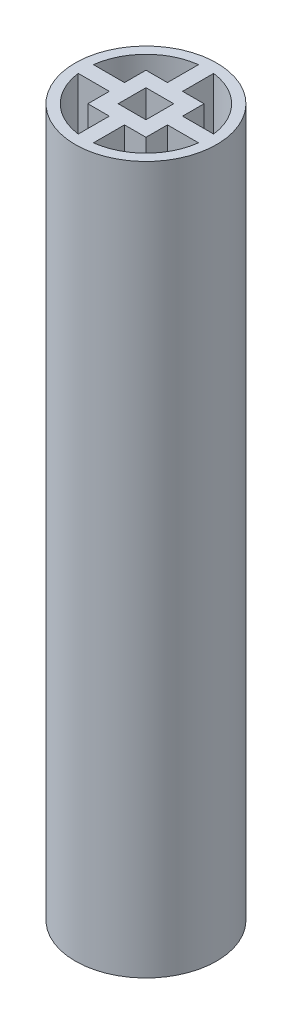
ISO-10303-21;
HEADER;
FILE_DESCRIPTION(('STEP AP214'),'2;1');
FILE_NAME('part.step','',(''),(''),'','','');
FILE_SCHEMA(('AUTOMOTIVE_DESIGN { 1 0 10303 214 1 1 1 1 }'));
ENDSEC;
DATA;
#1=APPLICATION_CONTEXT('core data for automotive mechanical design processes');
#2=APPLICATION_PROTOCOL_DEFINITION('international standard','automotive_design',2000,#1);
#3=PRODUCT_CONTEXT('',#1,'mechanical');
#4=PRODUCT('Part','Part','',(#3));
#5=PRODUCT_RELATED_PRODUCT_CATEGORY('part','',(#4));
#6=PRODUCT_DEFINITION_FORMATION('','',#4);
#7=PRODUCT_DEFINITION_CONTEXT('part definition',#1,'design');
#8=PRODUCT_DEFINITION('design','',#6,#7);
#9=PRODUCT_DEFINITION_SHAPE('','',#8);
#10=(LENGTH_UNIT() NAMED_UNIT(*) SI_UNIT(.MILLI.,.METRE.));
#11=(NAMED_UNIT(*) PLANE_ANGLE_UNIT() SI_UNIT($,.RADIAN.));
#12=(NAMED_UNIT(*) SI_UNIT($,.STERADIAN.) SOLID_ANGLE_UNIT());
#13=UNCERTAINTY_MEASURE_WITH_UNIT(LENGTH_MEASURE(1.E-05),#10,'distance_accuracy_value','');
#14=(GEOMETRIC_REPRESENTATION_CONTEXT(3) GLOBAL_UNCERTAINTY_ASSIGNED_CONTEXT((#13)) GLOBAL_UNIT_ASSIGNED_CONTEXT((#10,
#11,#12)) REPRESENTATION_CONTEXT('',''));
#15=CARTESIAN_POINT('',(0.,0.,0.));
#16=DIRECTION('',(0.,0.,1.));
#17=DIRECTION('',(1.,0.,0.));
#18=AXIS2_PLACEMENT_3D('',#15,#16,#17);
#19=CARTESIAN_POINT('',(0.,70.,0.));
#20=DIRECTION('',(0.,1.,0.));
#21=DIRECTION('',(0.,0.,1.));
#22=AXIS2_PLACEMENT_3D('',#19,#20,#21);
#23=PLANE('',#22);
#24=CARTESIAN_POINT('',(0.,70.,0.));
#25=DIRECTION('',(0.,1.,0.));
#26=DIRECTION('',(0.,0.,1.));
#27=AXIS2_PLACEMENT_3D('',#24,#25,#26);
#28=CIRCLE('',#27,14.);
#29=CARTESIAN_POINT('',(0.,70.,14.));
#30=VERTEX_POINT('',#29);
#31=EDGE_CURVE('E11',#30,#30,#28,.T.);
#32=ORIENTED_EDGE('',*,*,#31,.T.);
#33=EDGE_LOOP('',(#32));
#34=FACE_BOUND('',#33,.T.);
#35=DIRECTION('',(1.,0.,0.));
#36=VECTOR('',#35,1.);
#37=CARTESIAN_POINT('',(2.75,70.,2.75));
#38=LINE('',#37,#36);
#39=CARTESIAN_POINT('',(-2.75,70.,2.75));
#40=VERTEX_POINT('',#39);
#41=CARTESIAN_POINT('',(2.75,70.,2.75));
#42=VERTEX_POINT('',#41);
#43=EDGE_CURVE('E356',#40,#42,#38,.T.);
#44=ORIENTED_EDGE('',*,*,#43,.F.);
#45=DIRECTION('',(0.,0.,1.));
#46=VECTOR('',#45,1.);
#47=CARTESIAN_POINT('',(-2.75,70.,2.75));
#48=LINE('',#47,#46);
#49=CARTESIAN_POINT('',(-2.75,70.,-2.74999999999999));
#50=VERTEX_POINT('',#49);
#51=EDGE_CURVE('E354',#50,#40,#48,.T.);
#52=ORIENTED_EDGE('',*,*,#51,.F.);
#53=DIRECTION('',(-1.,0.,0.));
#54=VECTOR('',#53,1.);
#55=CARTESIAN_POINT('',(2.75,70.,-2.75));
#56=LINE('',#55,#54);
#57=CARTESIAN_POINT('',(2.75,70.,-2.75));
#58=VERTEX_POINT('',#57);
#59=EDGE_CURVE('E362',#58,#50,#56,.T.);
#60=ORIENTED_EDGE('',*,*,#59,.F.);
#61=DIRECTION('',(0.,0.,-1.));
#62=VECTOR('',#61,1.);
#63=CARTESIAN_POINT('',(2.75,70.,2.75));
#64=LINE('',#63,#62);
#65=EDGE_CURVE('E359',#42,#58,#64,.T.);
#66=ORIENTED_EDGE('',*,*,#65,.F.);
#67=EDGE_LOOP('',(#44,#52,#60,#66));
#68=FACE_BOUND('',#67,.T.);
#69=DIRECTION('',(0.,0.,-1.));
#70=VECTOR('',#69,1.);
#71=CARTESIAN_POINT('',(-1.5,70.,-11.9058808997907));
#72=LINE('',#71,#70);
#73=CARTESIAN_POINT('',(-1.5,70.,-5.75));
#74=VERTEX_POINT('',#73);
#75=CARTESIAN_POINT('',(-1.5,70.,-11.9058808997907));
#76=VERTEX_POINT('',#75);
#77=EDGE_CURVE('E318',#74,#76,#72,.T.);
#78=ORIENTED_EDGE('',*,*,#77,.F.);
#79=DIRECTION('',(1.,0.,0.));
#80=VECTOR('',#79,1.);
#81=CARTESIAN_POINT('',(-1.5,70.,-5.75));
#82=LINE('',#81,#80);
#83=CARTESIAN_POINT('',(-5.75,70.,-5.75));
#84=VERTEX_POINT('',#83);
#85=EDGE_CURVE('E316',#84,#74,#82,.T.);
#86=ORIENTED_EDGE('',*,*,#85,.F.);
#87=DIRECTION('',(0.,0.,-1.));
#88=VECTOR('',#87,1.);
#89=CARTESIAN_POINT('',(-5.75,70.,-1.5));
#90=LINE('',#89,#88);
#91=CARTESIAN_POINT('',(-5.75,70.,-1.5));
#92=VERTEX_POINT('',#91);
#93=EDGE_CURVE('E326',#92,#84,#90,.T.);
#94=ORIENTED_EDGE('',*,*,#93,.F.);
#95=DIRECTION('',(1.,0.,0.));
#96=VECTOR('',#95,1.);
#97=CARTESIAN_POINT('',(-5.75,70.,-1.5));
#98=LINE('',#97,#96);
#99=CARTESIAN_POINT('',(-11.9058808997907,70.,-1.5));
#100=VERTEX_POINT('',#99);
#101=EDGE_CURVE('E323',#100,#92,#98,.T.);
#102=ORIENTED_EDGE('',*,*,#101,.F.);
#103=CARTESIAN_POINT('',(0.,70.,0.));
#104=DIRECTION('',(0.,1.,0.));
#105=DIRECTION('',(0.,0.,1.));
#106=AXIS2_PLACEMENT_3D('',#103,#104,#105);
#107=CIRCLE('',#106,12.);
#108=EDGE_CURVE('E321',#76,#100,#107,.T.);
#109=ORIENTED_EDGE('',*,*,#108,.F.);
#110=EDGE_LOOP('',(#78,#86,#94,#102,#109));
#111=FACE_BOUND('',#110,.T.);
#112=DIRECTION('',(-1.,0.,0.));
#113=VECTOR('',#112,1.);
#114=CARTESIAN_POINT('',(5.75,70.,5.75));
#115=LINE('',#114,#113);
#116=CARTESIAN_POINT('',(5.75,70.,5.75));
#117=VERTEX_POINT('',#116);
#118=CARTESIAN_POINT('',(1.5,70.,5.75));
#119=VERTEX_POINT('',#118);
#120=EDGE_CURVE('E280',#117,#119,#115,.T.);
#121=ORIENTED_EDGE('',*,*,#120,.F.);
#122=DIRECTION('',(0.,0.,1.));
#123=VECTOR('',#122,1.);
#124=CARTESIAN_POINT('',(5.75,70.,5.75));
#125=LINE('',#124,#123);
#126=CARTESIAN_POINT('',(5.75,70.,1.5));
#127=VERTEX_POINT('',#126);
#128=EDGE_CURVE('E278',#127,#117,#125,.T.);
#129=ORIENTED_EDGE('',*,*,#128,.F.);
#130=DIRECTION('',(-1.,0.,0.));
#131=VECTOR('',#130,1.);
#132=CARTESIAN_POINT('',(5.75,70.,1.5));
#133=LINE('',#132,#131);
#134=CARTESIAN_POINT('',(11.9058808997907,70.,1.5));
#135=VERTEX_POINT('',#134);
#136=EDGE_CURVE('E288',#135,#127,#133,.T.);
#137=ORIENTED_EDGE('',*,*,#136,.F.);
#138=CARTESIAN_POINT('',(0.,70.,0.));
#139=DIRECTION('',(0.,1.,0.));
#140=DIRECTION('',(0.,0.,1.));
#141=AXIS2_PLACEMENT_3D('',#138,#139,#140);
#142=CIRCLE('',#141,12.);
#143=CARTESIAN_POINT('',(1.5,70.,11.9058808997907));
#144=VERTEX_POINT('',#143);
#145=EDGE_CURVE('E285',#144,#135,#142,.T.);
#146=ORIENTED_EDGE('',*,*,#145,.F.);
#147=DIRECTION('',(0.,0.,1.));
#148=VECTOR('',#147,1.);
#149=CARTESIAN_POINT('',(1.5,70.,11.9058808997907));
#150=LINE('',#149,#148);
#151=EDGE_CURVE('E283',#119,#144,#150,.T.);
#152=ORIENTED_EDGE('',*,*,#151,.F.);
#153=EDGE_LOOP('',(#121,#129,#137,#146,#152));
#154=FACE_BOUND('',#153,.T.);
#155=DIRECTION('',(1.,0.,0.));
#156=VECTOR('',#155,1.);
#157=CARTESIAN_POINT('',(11.9058808997907,70.,-1.5));
#158=LINE('',#157,#156);
#159=CARTESIAN_POINT('',(5.75,70.,-1.5));
#160=VERTEX_POINT('',#159);
#161=CARTESIAN_POINT('',(11.9058808997907,70.,-1.5));
#162=VERTEX_POINT('',#161);
#163=EDGE_CURVE('E242',#160,#162,#158,.T.);
#164=ORIENTED_EDGE('',*,*,#163,.F.);
#165=DIRECTION('',(0.,0.,1.));
#166=VECTOR('',#165,1.);
#167=CARTESIAN_POINT('',(5.75,70.,-1.5));
#168=LINE('',#167,#166);
#169=CARTESIAN_POINT('',(5.75,70.,-5.75));
#170=VERTEX_POINT('',#169);
#171=EDGE_CURVE('E240',#170,#160,#168,.T.);
#172=ORIENTED_EDGE('',*,*,#171,.F.);
#173=DIRECTION('',(1.,0.,0.));
#174=VECTOR('',#173,1.);
#175=CARTESIAN_POINT('',(5.75,70.,-5.75));
#176=LINE('',#175,#174);
#177=CARTESIAN_POINT('',(1.5,70.,-5.75));
#178=VERTEX_POINT('',#177);
#179=EDGE_CURVE('E250',#178,#170,#176,.T.);
#180=ORIENTED_EDGE('',*,*,#179,.F.);
#181=DIRECTION('',(0.,0.,1.));
#182=VECTOR('',#181,1.);
#183=CARTESIAN_POINT('',(1.5,70.,-5.75));
#184=LINE('',#183,#182);
#185=CARTESIAN_POINT('',(1.5,70.,-11.9058808997907));
#186=VERTEX_POINT('',#185);
#187=EDGE_CURVE('E247',#186,#178,#184,.T.);
#188=ORIENTED_EDGE('',*,*,#187,.F.);
#189=CARTESIAN_POINT('',(0.,70.,0.));
#190=DIRECTION('',(0.,1.,0.));
#191=DIRECTION('',(0.,0.,1.));
#192=AXIS2_PLACEMENT_3D('',#189,#190,#191);
#193=CIRCLE('',#192,12.);
#194=EDGE_CURVE('E245',#162,#186,#193,.T.);
#195=ORIENTED_EDGE('',*,*,#194,.F.);
#196=EDGE_LOOP('',(#164,#172,#180,#188,#195));
#197=FACE_BOUND('',#196,.T.);
#198=DIRECTION('',(0.,0.,-1.));
#199=VECTOR('',#198,1.);
#200=CARTESIAN_POINT('',(-5.75,70.,5.75));
#201=LINE('',#200,#199);
#202=CARTESIAN_POINT('',(-5.75,70.,5.75));
#203=VERTEX_POINT('',#202);
#204=CARTESIAN_POINT('',(-5.75,70.,1.5));
#205=VERTEX_POINT('',#204);
#206=EDGE_CURVE('E204',#203,#205,#201,.T.);
#207=ORIENTED_EDGE('',*,*,#206,.F.);
#208=DIRECTION('',(-1.,0.,0.));
#209=VECTOR('',#208,1.);
#210=CARTESIAN_POINT('',(-1.5,70.,5.75));
#211=LINE('',#210,#209);
#212=CARTESIAN_POINT('',(-1.5,70.,5.75));
#213=VERTEX_POINT('',#212);
#214=EDGE_CURVE('E196',#213,#203,#211,.T.);
#215=ORIENTED_EDGE('',*,*,#214,.F.);
#216=DIRECTION('',(0.,0.,-1.));
#217=VECTOR('',#216,1.);
#218=CARTESIAN_POINT('',(-1.5,70.,5.75));
#219=LINE('',#218,#217);
#220=CARTESIAN_POINT('',(-1.5,70.,11.9058808997907));
#221=VERTEX_POINT('',#220);
#222=EDGE_CURVE('E223',#221,#213,#219,.T.);
#223=ORIENTED_EDGE('',*,*,#222,.F.);
#224=CARTESIAN_POINT('',(0.,70.,0.));
#225=DIRECTION('',(0.,1.,0.));
#226=DIRECTION('',(0.,0.,1.));
#227=AXIS2_PLACEMENT_3D('',#224,#225,#226);
#228=CIRCLE('',#227,12.);
#229=CARTESIAN_POINT('',(-11.9058808997907,70.,1.5));
#230=VERTEX_POINT('',#229);
#231=EDGE_CURVE('E219',#230,#221,#228,.T.);
#232=ORIENTED_EDGE('',*,*,#231,.F.);
#233=DIRECTION('',(-1.,0.,0.));
#234=VECTOR('',#233,1.);
#235=CARTESIAN_POINT('',(-11.9058808997907,70.,1.5));
#236=LINE('',#235,#234);
#237=EDGE_CURVE('E217',#205,#230,#236,.T.);
#238=ORIENTED_EDGE('',*,*,#237,.F.);
#239=EDGE_LOOP('',(#207,#215,#223,#232,#238));
#240=FACE_BOUND('',#239,.T.);
#241=ADVANCED_FACE('F35',(#34,#68,#111,#154,#197,#240),#23,.T.);
#242=CARTESIAN_POINT('',(0.,-70.,0.));
#243=DIRECTION('',(0.,1.,0.));
#244=DIRECTION('',(0.,0.,1.));
#245=AXIS2_PLACEMENT_3D('',#242,#243,#244);
#246=PLANE('',#245);
#247=DIRECTION('',(0.,0.,1.));
#248=VECTOR('',#247,1.);
#249=CARTESIAN_POINT('',(5.75,-70.,-1.5));
#250=LINE('',#249,#248);
#251=CARTESIAN_POINT('',(5.75,-70.,-5.75));
#252=VERTEX_POINT('',#251);
#253=CARTESIAN_POINT('',(5.75,-70.,-1.5));
#254=VERTEX_POINT('',#253);
#255=EDGE_CURVE('E212',#252,#254,#250,.T.);
#256=ORIENTED_EDGE('',*,*,#255,.T.);
#257=DIRECTION('',(1.,0.,0.));
#258=VECTOR('',#257,1.);
#259=CARTESIAN_POINT('',(11.9058808997907,-70.,-1.5));
#260=LINE('',#259,#258);
#261=CARTESIAN_POINT('',(11.9058808997907,-70.,-1.5));
#262=VERTEX_POINT('',#261);
#263=EDGE_CURVE('E255',#254,#262,#260,.T.);
#264=ORIENTED_EDGE('',*,*,#263,.T.);
#265=CARTESIAN_POINT('',(0.,-70.,0.));
#266=DIRECTION('',(0.,1.,0.));
#267=DIRECTION('',(0.,0.,1.));
#268=AXIS2_PLACEMENT_3D('',#265,#266,#267);
#269=CIRCLE('',#268,12.);
#270=CARTESIAN_POINT('',(1.5,-70.,-11.9058808997907));
#271=VERTEX_POINT('',#270);
#272=EDGE_CURVE('E258',#262,#271,#269,.T.);
#273=ORIENTED_EDGE('',*,*,#272,.T.);
#274=DIRECTION('',(0.,0.,1.));
#275=VECTOR('',#274,1.);
#276=CARTESIAN_POINT('',(1.5,-70.,-5.75));
#277=LINE('',#276,#275);
#278=CARTESIAN_POINT('',(1.5,-70.,-5.75));
#279=VERTEX_POINT('',#278);
#280=EDGE_CURVE('E261',#271,#279,#277,.T.);
#281=ORIENTED_EDGE('',*,*,#280,.T.);
#282=DIRECTION('',(1.,0.,0.));
#283=VECTOR('',#282,1.);
#284=CARTESIAN_POINT('',(5.75,-70.,-5.75));
#285=LINE('',#284,#283);
#286=EDGE_CURVE('E243',#279,#252,#285,.T.);
#287=ORIENTED_EDGE('',*,*,#286,.T.);
#288=EDGE_LOOP('',(#256,#264,#273,#281,#287));
#289=FACE_BOUND('',#288,.T.);
#290=DIRECTION('',(1.,0.,0.));
#291=VECTOR('',#290,1.);
#292=CARTESIAN_POINT('',(-1.5,-70.,-5.75));
#293=LINE('',#292,#291);
#294=CARTESIAN_POINT('',(-5.75,-70.,-5.75));
#295=VERTEX_POINT('',#294);
#296=CARTESIAN_POINT('',(-1.5,-70.,-5.75));
#297=VERTEX_POINT('',#296);
#298=EDGE_CURVE('E315',#295,#297,#293,.T.);
#299=ORIENTED_EDGE('',*,*,#298,.T.);
#300=DIRECTION('',(0.,0.,-1.));
#301=VECTOR('',#300,1.);
#302=CARTESIAN_POINT('',(-1.5,-70.,-11.9058808997907));
#303=LINE('',#302,#301);
#304=CARTESIAN_POINT('',(-1.5,-70.,-11.9058808997907));
#305=VERTEX_POINT('',#304);
#306=EDGE_CURVE('E331',#297,#305,#303,.T.);
#307=ORIENTED_EDGE('',*,*,#306,.T.);
#308=CARTESIAN_POINT('',(0.,-70.,0.));
#309=DIRECTION('',(0.,1.,0.));
#310=DIRECTION('',(0.,0.,1.));
#311=AXIS2_PLACEMENT_3D('',#308,#309,#310);
#312=CIRCLE('',#311,12.);
#313=CARTESIAN_POINT('',(-11.9058808997907,-70.,-1.5));
#314=VERTEX_POINT('',#313);
#315=EDGE_CURVE('E334',#305,#314,#312,.T.);
#316=ORIENTED_EDGE('',*,*,#315,.T.);
#317=DIRECTION('',(1.,0.,0.));
#318=VECTOR('',#317,1.);
#319=CARTESIAN_POINT('',(-5.75,-70.,-1.5));
#320=LINE('',#319,#318);
#321=CARTESIAN_POINT('',(-5.75,-70.,-1.5));
#322=VERTEX_POINT('',#321);
#323=EDGE_CURVE('E337',#314,#322,#320,.T.);
#324=ORIENTED_EDGE('',*,*,#323,.T.);
#325=DIRECTION('',(0.,0.,-1.));
#326=VECTOR('',#325,1.);
#327=CARTESIAN_POINT('',(-5.75,-70.,-1.5));
#328=LINE('',#327,#326);
#329=EDGE_CURVE('E319',#322,#295,#328,.T.);
#330=ORIENTED_EDGE('',*,*,#329,.T.);
#331=EDGE_LOOP('',(#299,#307,#316,#324,#330));
#332=FACE_BOUND('',#331,.T.);
#333=CARTESIAN_POINT('',(0.,-70.,0.));
#334=DIRECTION('',(0.,1.,0.));
#335=DIRECTION('',(0.,0.,1.));
#336=AXIS2_PLACEMENT_3D('',#333,#334,#335);
#337=CIRCLE('',#336,14.);
#338=CARTESIAN_POINT('',(0.,-70.,14.));
#339=VERTEX_POINT('',#338);
#340=EDGE_CURVE('E39',#339,#339,#337,.T.);
#341=ORIENTED_EDGE('',*,*,#340,.F.);
#342=EDGE_LOOP('',(#341));
#343=FACE_BOUND('',#342,.T.);
#344=DIRECTION('',(0.,0.,1.));
#345=VECTOR('',#344,1.);
#346=CARTESIAN_POINT('',(-2.75,-70.,2.75));
#347=LINE('',#346,#345);
#348=CARTESIAN_POINT('',(-2.75,-70.,-2.74999999999999));
#349=VERTEX_POINT('',#348);
#350=CARTESIAN_POINT('',(-2.75,-70.,2.75));
#351=VERTEX_POINT('',#350);
#352=EDGE_CURVE('E353',#349,#351,#347,.T.);
#353=ORIENTED_EDGE('',*,*,#352,.T.);
#354=DIRECTION('',(1.,0.,0.));
#355=VECTOR('',#354,1.);
#356=CARTESIAN_POINT('',(2.75,-70.,2.75));
#357=LINE('',#356,#355);
#358=CARTESIAN_POINT('',(2.75,-70.,2.75));
#359=VERTEX_POINT('',#358);
#360=EDGE_CURVE('E367',#351,#359,#357,.T.);
#361=ORIENTED_EDGE('',*,*,#360,.T.);
#362=DIRECTION('',(0.,0.,-1.));
#363=VECTOR('',#362,1.);
#364=CARTESIAN_POINT('',(2.75,-70.,2.75));
#365=LINE('',#364,#363);
#366=CARTESIAN_POINT('',(2.75,-70.,-2.75));
#367=VERTEX_POINT('',#366);
#368=EDGE_CURVE('E370',#359,#367,#365,.T.);
#369=ORIENTED_EDGE('',*,*,#368,.T.);
#370=DIRECTION('',(-1.,0.,0.));
#371=VECTOR('',#370,1.);
#372=CARTESIAN_POINT('',(2.75,-70.,-2.75));
#373=LINE('',#372,#371);
#374=EDGE_CURVE('E357',#367,#349,#373,.T.);
#375=ORIENTED_EDGE('',*,*,#374,.T.);
#376=EDGE_LOOP('',(#353,#361,#369,#375));
#377=FACE_BOUND('',#376,.T.);
#378=DIRECTION('',(0.,0.,1.));
#379=VECTOR('',#378,1.);
#380=CARTESIAN_POINT('',(5.75,-70.,5.75));
#381=LINE('',#380,#379);
#382=CARTESIAN_POINT('',(5.75,-70.,1.5));
#383=VERTEX_POINT('',#382);
#384=CARTESIAN_POINT('',(5.75,-70.,5.75));
#385=VERTEX_POINT('',#384);
#386=EDGE_CURVE('E277',#383,#385,#381,.T.);
#387=ORIENTED_EDGE('',*,*,#386,.T.);
#388=DIRECTION('',(-1.,0.,0.));
#389=VECTOR('',#388,1.);
#390=CARTESIAN_POINT('',(5.75,-70.,5.75));
#391=LINE('',#390,#389);
#392=CARTESIAN_POINT('',(1.5,-70.,5.75));
#393=VERTEX_POINT('',#392);
#394=EDGE_CURVE('E293',#385,#393,#391,.T.);
#395=ORIENTED_EDGE('',*,*,#394,.T.);
#396=DIRECTION('',(0.,0.,1.));
#397=VECTOR('',#396,1.);
#398=CARTESIAN_POINT('',(1.5,-70.,11.9058808997907));
#399=LINE('',#398,#397);
#400=CARTESIAN_POINT('',(1.5,-70.,11.9058808997907));
#401=VERTEX_POINT('',#400);
#402=EDGE_CURVE('E296',#393,#401,#399,.T.);
#403=ORIENTED_EDGE('',*,*,#402,.T.);
#404=CARTESIAN_POINT('',(0.,-70.,0.));
#405=DIRECTION('',(0.,1.,0.));
#406=DIRECTION('',(0.,0.,1.));
#407=AXIS2_PLACEMENT_3D('',#404,#405,#406);
#408=CIRCLE('',#407,12.);
#409=CARTESIAN_POINT('',(11.9058808997907,-70.,1.5));
#410=VERTEX_POINT('',#409);
#411=EDGE_CURVE('E299',#401,#410,#408,.T.);
#412=ORIENTED_EDGE('',*,*,#411,.T.);
#413=DIRECTION('',(-1.,0.,0.));
#414=VECTOR('',#413,1.);
#415=CARTESIAN_POINT('',(5.75,-70.,1.5));
#416=LINE('',#415,#414);
#417=EDGE_CURVE('E281',#410,#383,#416,.T.);
#418=ORIENTED_EDGE('',*,*,#417,.T.);
#419=EDGE_LOOP('',(#387,#395,#403,#412,#418));
#420=FACE_BOUND('',#419,.T.);
#421=DIRECTION('',(-1.,0.,0.));
#422=VECTOR('',#421,1.);
#423=CARTESIAN_POINT('',(-1.5,-70.,5.75));
#424=LINE('',#423,#422);
#425=CARTESIAN_POINT('',(-1.5,-70.,5.75));
#426=VERTEX_POINT('',#425);
#427=CARTESIAN_POINT('',(-5.75,-70.,5.75));
#428=VERTEX_POINT('',#427);
#429=EDGE_CURVE('E58',#426,#428,#424,.T.);
#430=ORIENTED_EDGE('',*,*,#429,.T.);
#431=DIRECTION('',(0.,0.,-1.));
#432=VECTOR('',#431,1.);
#433=CARTESIAN_POINT('',(-5.75,-70.,5.75));
#434=LINE('',#433,#432);
#435=CARTESIAN_POINT('',(-5.75,-70.,1.5));
#436=VERTEX_POINT('',#435);
#437=EDGE_CURVE('E211',#428,#436,#434,.T.);
#438=ORIENTED_EDGE('',*,*,#437,.T.);
#439=DIRECTION('',(-1.,0.,0.));
#440=VECTOR('',#439,1.);
#441=CARTESIAN_POINT('',(-11.9058808997907,-70.,1.5));
#442=LINE('',#441,#440);
#443=CARTESIAN_POINT('',(-11.9058808997907,-70.,1.5));
#444=VERTEX_POINT('',#443);
#445=EDGE_CURVE('E227',#436,#444,#442,.T.);
#446=ORIENTED_EDGE('',*,*,#445,.T.);
#447=CARTESIAN_POINT('',(0.,-70.,0.));
#448=DIRECTION('',(0.,1.,0.));
#449=DIRECTION('',(0.,0.,1.));
#450=AXIS2_PLACEMENT_3D('',#447,#448,#449);
#451=CIRCLE('',#450,12.);
#452=CARTESIAN_POINT('',(-1.5,-70.,11.9058808997907));
#453=VERTEX_POINT('',#452);
#454=EDGE_CURVE('E230',#444,#453,#451,.T.);
#455=ORIENTED_EDGE('',*,*,#454,.T.);
#456=DIRECTION('',(0.,0.,-1.));
#457=VECTOR('',#456,1.);
#458=CARTESIAN_POINT('',(-1.5,-70.,5.75));
#459=LINE('',#458,#457);
#460=EDGE_CURVE('E205',#453,#426,#459,.T.);
#461=ORIENTED_EDGE('',*,*,#460,.T.);
#462=EDGE_LOOP('',(#430,#438,#446,#455,#461));
#463=FACE_BOUND('',#462,.T.);
#464=ADVANCED_FACE('F389',(#289,#332,#343,#377,#420,#463),#246,.F.);
#465=CARTESIAN_POINT('',(0.,70.,0.));
#466=DIRECTION('',(0.,-1.,0.));
#467=DIRECTION('',(0.,0.,-1.));
#468=AXIS2_PLACEMENT_3D('',#465,#466,#467);
#469=CYLINDRICAL_SURFACE('',#468,14.);
#470=ORIENTED_EDGE('',*,*,#31,.F.);
#471=EDGE_LOOP('',(#470));
#472=FACE_BOUND('',#471,.T.);
#473=ORIENTED_EDGE('',*,*,#340,.T.);
#474=EDGE_LOOP('',(#473));
#475=FACE_BOUND('',#474,.T.);
#476=ADVANCED_FACE('F37',(#472,#475),#469,.T.);
#477=CARTESIAN_POINT('',(-2.75,70.,2.75));
#478=DIRECTION('',(1.,0.,0.));
#479=DIRECTION('',(0.,0.,-1.));
#480=AXIS2_PLACEMENT_3D('',#477,#478,#479);
#481=PLANE('',#480);
#482=ORIENTED_EDGE('',*,*,#352,.F.);
#483=DIRECTION('',(0.,-1.,0.));
#484=VECTOR('',#483,1.);
#485=CARTESIAN_POINT('',(-2.75,70.,-2.74999999999999));
#486=LINE('',#485,#484);
#487=EDGE_CURVE('E364',#50,#349,#486,.T.);
#488=ORIENTED_EDGE('',*,*,#487,.F.);
#489=ORIENTED_EDGE('',*,*,#51,.T.);
#490=DIRECTION('',(0.,-1.,0.));
#491=VECTOR('',#490,1.);
#492=CARTESIAN_POINT('',(-2.75,70.,2.75));
#493=LINE('',#492,#491);
#494=EDGE_CURVE('E381',#40,#351,#493,.T.);
#495=ORIENTED_EDGE('',*,*,#494,.T.);
#496=EDGE_LOOP('',(#482,#488,#489,#495));
#497=FACE_BOUND('',#496,.T.);
#498=ADVANCED_FACE('F418',(#497),#481,.T.);
#499=CARTESIAN_POINT('',(2.75,70.,2.75));
#500=DIRECTION('',(0.,0.,-1.));
#501=DIRECTION('',(-1.,0.,0.));
#502=AXIS2_PLACEMENT_3D('',#499,#500,#501);
#503=PLANE('',#502);
#504=ORIENTED_EDGE('',*,*,#360,.F.);
#505=ORIENTED_EDGE('',*,*,#494,.F.);
#506=ORIENTED_EDGE('',*,*,#43,.T.);
#507=DIRECTION('',(0.,-1.,0.));
#508=VECTOR('',#507,1.);
#509=CARTESIAN_POINT('',(2.75,70.,2.75));
#510=LINE('',#509,#508);
#511=EDGE_CURVE('E379',#42,#359,#510,.T.);
#512=ORIENTED_EDGE('',*,*,#511,.T.);
#513=EDGE_LOOP('',(#504,#505,#506,#512));
#514=FACE_BOUND('',#513,.T.);
#515=ADVANCED_FACE('F421',(#514),#503,.T.);
#516=CARTESIAN_POINT('',(2.75,70.,2.75));
#517=DIRECTION('',(-1.,0.,0.));
#518=DIRECTION('',(0.,0.,1.));
#519=AXIS2_PLACEMENT_3D('',#516,#517,#518);
#520=PLANE('',#519);
#521=ORIENTED_EDGE('',*,*,#368,.F.);
#522=ORIENTED_EDGE('',*,*,#511,.F.);
#523=ORIENTED_EDGE('',*,*,#65,.T.);
#524=DIRECTION('',(0.,-1.,0.));
#525=VECTOR('',#524,1.);
#526=CARTESIAN_POINT('',(2.75,70.,-2.75));
#527=LINE('',#526,#525);
#528=EDGE_CURVE('E377',#58,#367,#527,.T.);
#529=ORIENTED_EDGE('',*,*,#528,.T.);
#530=EDGE_LOOP('',(#521,#522,#523,#529));
#531=FACE_BOUND('',#530,.T.);
#532=ADVANCED_FACE('F424',(#531),#520,.T.);
#533=CARTESIAN_POINT('',(2.75,70.,-2.75));
#534=DIRECTION('',(0.,0.,1.));
#535=DIRECTION('',(1.,0.,0.));
#536=AXIS2_PLACEMENT_3D('',#533,#534,#535);
#537=PLANE('',#536);
#538=ORIENTED_EDGE('',*,*,#374,.F.);
#539=ORIENTED_EDGE('',*,*,#528,.F.);
#540=ORIENTED_EDGE('',*,*,#59,.T.);
#541=ORIENTED_EDGE('',*,*,#487,.T.);
#542=EDGE_LOOP('',(#538,#539,#540,#541));
#543=FACE_BOUND('',#542,.T.);
#544=ADVANCED_FACE('F428',(#543),#537,.T.);
#545=CARTESIAN_POINT('',(-1.5,70.,-5.75));
#546=DIRECTION('',(0.,0.,-1.));
#547=DIRECTION('',(-1.,0.,0.));
#548=AXIS2_PLACEMENT_3D('',#545,#546,#547);
#549=PLANE('',#548);
#550=ORIENTED_EDGE('',*,*,#298,.F.);
#551=DIRECTION('',(0.,-1.,0.));
#552=VECTOR('',#551,1.);
#553=CARTESIAN_POINT('',(-5.75,70.,-5.75));
#554=LINE('',#553,#552);
#555=EDGE_CURVE('E328',#84,#295,#554,.T.);
#556=ORIENTED_EDGE('',*,*,#555,.F.);
#557=ORIENTED_EDGE('',*,*,#85,.T.);
#558=DIRECTION('',(0.,-1.,0.));
#559=VECTOR('',#558,1.);
#560=CARTESIAN_POINT('',(-1.5,70.,-5.75));
#561=LINE('',#560,#559);
#562=EDGE_CURVE('E350',#74,#297,#561,.T.);
#563=ORIENTED_EDGE('',*,*,#562,.T.);
#564=EDGE_LOOP('',(#550,#556,#557,#563));
#565=FACE_BOUND('',#564,.T.);
#566=ADVANCED_FACE('F432',(#565),#549,.T.);
#567=CARTESIAN_POINT('',(-1.5,70.,-11.9058808997907));
#568=DIRECTION('',(-1.,0.,0.));
#569=DIRECTION('',(0.,0.,1.));
#570=AXIS2_PLACEMENT_3D('',#567,#568,#569);
#571=PLANE('',#570);
#572=ORIENTED_EDGE('',*,*,#306,.F.);
#573=ORIENTED_EDGE('',*,*,#562,.F.);
#574=ORIENTED_EDGE('',*,*,#77,.T.);
#575=DIRECTION('',(0.,-1.,0.));
#576=VECTOR('',#575,1.);
#577=CARTESIAN_POINT('',(-1.5,70.,-11.9058808997907));
#578=LINE('',#577,#576);
#579=EDGE_CURVE('E348',#76,#305,#578,.T.);
#580=ORIENTED_EDGE('',*,*,#579,.T.);
#581=EDGE_LOOP('',(#572,#573,#574,#580));
#582=FACE_BOUND('',#581,.T.);
#583=ADVANCED_FACE('F436',(#582),#571,.T.);
#584=CARTESIAN_POINT('',(0.,70.,0.));
#585=DIRECTION('',(0.,-1.,0.));
#586=DIRECTION('',(0.,0.,-1.));
#587=AXIS2_PLACEMENT_3D('',#584,#585,#586);
#588=CYLINDRICAL_SURFACE('',#587,12.);
#589=ORIENTED_EDGE('',*,*,#315,.F.);
#590=ORIENTED_EDGE('',*,*,#579,.F.);
#591=ORIENTED_EDGE('',*,*,#108,.T.);
#592=DIRECTION('',(0.,-1.,0.));
#593=VECTOR('',#592,1.);
#594=CARTESIAN_POINT('',(-11.9058808997907,70.,-1.5));
#595=LINE('',#594,#593);
#596=EDGE_CURVE('E346',#100,#314,#595,.T.);
#597=ORIENTED_EDGE('',*,*,#596,.T.);
#598=EDGE_LOOP('',(#589,#590,#591,#597));
#599=FACE_BOUND('',#598,.T.);
#600=ADVANCED_FACE('F440',(#599),#588,.F.);
#601=CARTESIAN_POINT('',(-5.75,70.,-1.5));
#602=DIRECTION('',(0.,0.,-1.));
#603=DIRECTION('',(-1.,0.,0.));
#604=AXIS2_PLACEMENT_3D('',#601,#602,#603);
#605=PLANE('',#604);
#606=ORIENTED_EDGE('',*,*,#323,.F.);
#607=ORIENTED_EDGE('',*,*,#596,.F.);
#608=ORIENTED_EDGE('',*,*,#101,.T.);
#609=DIRECTION('',(0.,-1.,0.));
#610=VECTOR('',#609,1.);
#611=CARTESIAN_POINT('',(-5.75,70.,-1.5));
#612=LINE('',#611,#610);
#613=EDGE_CURVE('E344',#92,#322,#612,.T.);
#614=ORIENTED_EDGE('',*,*,#613,.T.);
#615=EDGE_LOOP('',(#606,#607,#608,#614));
#616=FACE_BOUND('',#615,.T.);
#617=ADVANCED_FACE('F444',(#616),#605,.T.);
#618=CARTESIAN_POINT('',(-5.75,70.,-1.5));
#619=DIRECTION('',(-1.,0.,0.));
#620=DIRECTION('',(0.,0.,1.));
#621=AXIS2_PLACEMENT_3D('',#618,#619,#620);
#622=PLANE('',#621);
#623=ORIENTED_EDGE('',*,*,#329,.F.);
#624=ORIENTED_EDGE('',*,*,#613,.F.);
#625=ORIENTED_EDGE('',*,*,#93,.T.);
#626=ORIENTED_EDGE('',*,*,#555,.T.);
#627=EDGE_LOOP('',(#623,#624,#625,#626));
#628=FACE_BOUND('',#627,.T.);
#629=ADVANCED_FACE('F448',(#628),#622,.T.);
#630=CARTESIAN_POINT('',(5.75,70.,5.75));
#631=DIRECTION('',(1.,0.,0.));
#632=DIRECTION('',(0.,0.,-1.));
#633=AXIS2_PLACEMENT_3D('',#630,#631,#632);
#634=PLANE('',#633);
#635=ORIENTED_EDGE('',*,*,#386,.F.);
#636=DIRECTION('',(0.,-1.,0.));
#637=VECTOR('',#636,1.);
#638=CARTESIAN_POINT('',(5.75,70.,1.5));
#639=LINE('',#638,#637);
#640=EDGE_CURVE('E290',#127,#383,#639,.T.);
#641=ORIENTED_EDGE('',*,*,#640,.F.);
#642=ORIENTED_EDGE('',*,*,#128,.T.);
#643=DIRECTION('',(0.,-1.,0.));
#644=VECTOR('',#643,1.);
#645=CARTESIAN_POINT('',(5.75,70.,5.75));
#646=LINE('',#645,#644);
#647=EDGE_CURVE('E312',#117,#385,#646,.T.);
#648=ORIENTED_EDGE('',*,*,#647,.T.);
#649=EDGE_LOOP('',(#635,#641,#642,#648));
#650=FACE_BOUND('',#649,.T.);
#651=ADVANCED_FACE('F452',(#650),#634,.T.);
#652=CARTESIAN_POINT('',(5.75,70.,5.75));
#653=DIRECTION('',(0.,0.,1.));
#654=DIRECTION('',(1.,0.,0.));
#655=AXIS2_PLACEMENT_3D('',#652,#653,#654);
#656=PLANE('',#655);
#657=ORIENTED_EDGE('',*,*,#394,.F.);
#658=ORIENTED_EDGE('',*,*,#647,.F.);
#659=ORIENTED_EDGE('',*,*,#120,.T.);
#660=DIRECTION('',(0.,-1.,0.));
#661=VECTOR('',#660,1.);
#662=CARTESIAN_POINT('',(1.5,70.,5.75));
#663=LINE('',#662,#661);
#664=EDGE_CURVE('E310',#119,#393,#663,.T.);
#665=ORIENTED_EDGE('',*,*,#664,.T.);
#666=EDGE_LOOP('',(#657,#658,#659,#665));
#667=FACE_BOUND('',#666,.T.);
#668=ADVANCED_FACE('F456',(#667),#656,.T.);
#669=CARTESIAN_POINT('',(1.5,70.,11.9058808997907));
#670=DIRECTION('',(1.,0.,0.));
#671=DIRECTION('',(0.,0.,-1.));
#672=AXIS2_PLACEMENT_3D('',#669,#670,#671);
#673=PLANE('',#672);
#674=ORIENTED_EDGE('',*,*,#402,.F.);
#675=ORIENTED_EDGE('',*,*,#664,.F.);
#676=ORIENTED_EDGE('',*,*,#151,.T.);
#677=DIRECTION('',(0.,-1.,0.));
#678=VECTOR('',#677,1.);
#679=CARTESIAN_POINT('',(1.5,70.,11.9058808997907));
#680=LINE('',#679,#678);
#681=EDGE_CURVE('E308',#144,#401,#680,.T.);
#682=ORIENTED_EDGE('',*,*,#681,.T.);
#683=EDGE_LOOP('',(#674,#675,#676,#682));
#684=FACE_BOUND('',#683,.T.);
#685=ADVANCED_FACE('F460',(#684),#673,.T.);
#686=CARTESIAN_POINT('',(0.,70.,0.));
#687=DIRECTION('',(0.,-1.,0.));
#688=DIRECTION('',(0.,0.,-1.));
#689=AXIS2_PLACEMENT_3D('',#686,#687,#688);
#690=CYLINDRICAL_SURFACE('',#689,12.);
#691=ORIENTED_EDGE('',*,*,#411,.F.);
#692=ORIENTED_EDGE('',*,*,#681,.F.);
#693=ORIENTED_EDGE('',*,*,#145,.T.);
#694=DIRECTION('',(0.,-1.,0.));
#695=VECTOR('',#694,1.);
#696=CARTESIAN_POINT('',(11.9058808997907,70.,1.5));
#697=LINE('',#696,#695);
#698=EDGE_CURVE('E306',#135,#410,#697,.T.);
#699=ORIENTED_EDGE('',*,*,#698,.T.);
#700=EDGE_LOOP('',(#691,#692,#693,#699));
#701=FACE_BOUND('',#700,.T.);
#702=ADVANCED_FACE('F464',(#701),#690,.F.);
#703=CARTESIAN_POINT('',(5.75,70.,1.5));
#704=DIRECTION('',(0.,0.,1.));
#705=DIRECTION('',(1.,0.,0.));
#706=AXIS2_PLACEMENT_3D('',#703,#704,#705);
#707=PLANE('',#706);
#708=ORIENTED_EDGE('',*,*,#417,.F.);
#709=ORIENTED_EDGE('',*,*,#698,.F.);
#710=ORIENTED_EDGE('',*,*,#136,.T.);
#711=ORIENTED_EDGE('',*,*,#640,.T.);
#712=EDGE_LOOP('',(#708,#709,#710,#711));
#713=FACE_BOUND('',#712,.T.);
#714=ADVANCED_FACE('F468',(#713),#707,.T.);
#715=CARTESIAN_POINT('',(5.75,70.,-1.5));
#716=DIRECTION('',(1.,0.,0.));
#717=DIRECTION('',(0.,0.,-1.));
#718=AXIS2_PLACEMENT_3D('',#715,#716,#717);
#719=PLANE('',#718);
#720=ORIENTED_EDGE('',*,*,#255,.F.);
#721=DIRECTION('',(0.,-1.,0.));
#722=VECTOR('',#721,1.);
#723=CARTESIAN_POINT('',(5.75,70.,-5.75));
#724=LINE('',#723,#722);
#725=EDGE_CURVE('E252',#170,#252,#724,.T.);
#726=ORIENTED_EDGE('',*,*,#725,.F.);
#727=ORIENTED_EDGE('',*,*,#171,.T.);
#728=DIRECTION('',(0.,-1.,0.));
#729=VECTOR('',#728,1.);
#730=CARTESIAN_POINT('',(5.75,70.,-1.5));
#731=LINE('',#730,#729);
#732=EDGE_CURVE('E274',#160,#254,#731,.T.);
#733=ORIENTED_EDGE('',*,*,#732,.T.);
#734=EDGE_LOOP('',(#720,#726,#727,#733));
#735=FACE_BOUND('',#734,.T.);
#736=ADVANCED_FACE('F472',(#735),#719,.T.);
#737=CARTESIAN_POINT('',(11.9058808997907,70.,-1.5));
#738=DIRECTION('',(0.,0.,-1.));
#739=DIRECTION('',(-1.,0.,0.));
#740=AXIS2_PLACEMENT_3D('',#737,#738,#739);
#741=PLANE('',#740);
#742=ORIENTED_EDGE('',*,*,#263,.F.);
#743=ORIENTED_EDGE('',*,*,#732,.F.);
#744=ORIENTED_EDGE('',*,*,#163,.T.);
#745=DIRECTION('',(0.,-1.,0.));
#746=VECTOR('',#745,1.);
#747=CARTESIAN_POINT('',(11.9058808997907,70.,-1.5));
#748=LINE('',#747,#746);
#749=EDGE_CURVE('E272',#162,#262,#748,.T.);
#750=ORIENTED_EDGE('',*,*,#749,.T.);
#751=EDGE_LOOP('',(#742,#743,#744,#750));
#752=FACE_BOUND('',#751,.T.);
#753=ADVANCED_FACE('F476',(#752),#741,.T.);
#754=CARTESIAN_POINT('',(0.,70.,0.));
#755=DIRECTION('',(0.,-1.,0.));
#756=DIRECTION('',(0.,0.,-1.));
#757=AXIS2_PLACEMENT_3D('',#754,#755,#756);
#758=CYLINDRICAL_SURFACE('',#757,12.);
#759=ORIENTED_EDGE('',*,*,#272,.F.);
#760=ORIENTED_EDGE('',*,*,#749,.F.);
#761=ORIENTED_EDGE('',*,*,#194,.T.);
#762=DIRECTION('',(0.,-1.,0.));
#763=VECTOR('',#762,1.);
#764=CARTESIAN_POINT('',(1.5,70.,-11.9058808997907));
#765=LINE('',#764,#763);
#766=EDGE_CURVE('E270',#186,#271,#765,.T.);
#767=ORIENTED_EDGE('',*,*,#766,.T.);
#768=EDGE_LOOP('',(#759,#760,#761,#767));
#769=FACE_BOUND('',#768,.T.);
#770=ADVANCED_FACE('F480',(#769),#758,.F.);
#771=CARTESIAN_POINT('',(1.5,70.,-5.75));
#772=DIRECTION('',(1.,0.,0.));
#773=DIRECTION('',(0.,0.,-1.));
#774=AXIS2_PLACEMENT_3D('',#771,#772,#773);
#775=PLANE('',#774);
#776=ORIENTED_EDGE('',*,*,#280,.F.);
#777=ORIENTED_EDGE('',*,*,#766,.F.);
#778=ORIENTED_EDGE('',*,*,#187,.T.);
#779=DIRECTION('',(0.,-1.,0.));
#780=VECTOR('',#779,1.);
#781=CARTESIAN_POINT('',(1.5,70.,-5.75));
#782=LINE('',#781,#780);
#783=EDGE_CURVE('E268',#178,#279,#782,.T.);
#784=ORIENTED_EDGE('',*,*,#783,.T.);
#785=EDGE_LOOP('',(#776,#777,#778,#784));
#786=FACE_BOUND('',#785,.T.);
#787=ADVANCED_FACE('F484',(#786),#775,.T.);
#788=CARTESIAN_POINT('',(5.75,70.,-5.75));
#789=DIRECTION('',(0.,0.,-1.));
#790=DIRECTION('',(-1.,0.,0.));
#791=AXIS2_PLACEMENT_3D('',#788,#789,#790);
#792=PLANE('',#791);
#793=ORIENTED_EDGE('',*,*,#286,.F.);
#794=ORIENTED_EDGE('',*,*,#783,.F.);
#795=ORIENTED_EDGE('',*,*,#179,.T.);
#796=ORIENTED_EDGE('',*,*,#725,.T.);
#797=EDGE_LOOP('',(#793,#794,#795,#796));
#798=FACE_BOUND('',#797,.T.);
#799=ADVANCED_FACE('F488',(#798),#792,.T.);
#800=CARTESIAN_POINT('',(-1.5,70.,5.75));
#801=DIRECTION('',(0.,0.,1.));
#802=DIRECTION('',(1.,0.,0.));
#803=AXIS2_PLACEMENT_3D('',#800,#801,#802);
#804=PLANE('',#803);
#805=ORIENTED_EDGE('',*,*,#429,.F.);
#806=DIRECTION('',(0.,-1.,0.));
#807=VECTOR('',#806,1.);
#808=CARTESIAN_POINT('',(-1.5,70.,5.75));
#809=LINE('',#808,#807);
#810=EDGE_CURVE('E200',#213,#426,#809,.T.);
#811=ORIENTED_EDGE('',*,*,#810,.F.);
#812=ORIENTED_EDGE('',*,*,#214,.T.);
#813=DIRECTION('',(0.,-1.,0.));
#814=VECTOR('',#813,1.);
#815=CARTESIAN_POINT('',(-5.75,70.,5.75));
#816=LINE('',#815,#814);
#817=EDGE_CURVE('E199',#203,#428,#816,.T.);
#818=ORIENTED_EDGE('',*,*,#817,.T.);
#819=EDGE_LOOP('',(#805,#811,#812,#818));
#820=FACE_BOUND('',#819,.T.);
#821=ADVANCED_FACE('F198',(#820),#804,.T.);
#822=CARTESIAN_POINT('',(-5.75,70.,5.75));
#823=DIRECTION('',(-1.,0.,0.));
#824=DIRECTION('',(0.,0.,1.));
#825=AXIS2_PLACEMENT_3D('',#822,#823,#824);
#826=PLANE('',#825);
#827=ORIENTED_EDGE('',*,*,#437,.F.);
#828=ORIENTED_EDGE('',*,*,#817,.F.);
#829=ORIENTED_EDGE('',*,*,#206,.T.);
#830=DIRECTION('',(0.,-1.,0.));
#831=VECTOR('',#830,1.);
#832=CARTESIAN_POINT('',(-5.75,70.,1.5));
#833=LINE('',#832,#831);
#834=EDGE_CURVE('E213',#205,#436,#833,.T.);
#835=ORIENTED_EDGE('',*,*,#834,.T.);
#836=EDGE_LOOP('',(#827,#828,#829,#835));
#837=FACE_BOUND('',#836,.T.);
#838=ADVANCED_FACE('F208',(#837),#826,.T.);
#839=CARTESIAN_POINT('',(-11.9058808997907,70.,1.5));
#840=DIRECTION('',(0.,0.,1.));
#841=DIRECTION('',(1.,0.,0.));
#842=AXIS2_PLACEMENT_3D('',#839,#840,#841);
#843=PLANE('',#842);
#844=ORIENTED_EDGE('',*,*,#445,.F.);
#845=ORIENTED_EDGE('',*,*,#834,.F.);
#846=ORIENTED_EDGE('',*,*,#237,.T.);
#847=DIRECTION('',(0.,-1.,0.));
#848=VECTOR('',#847,1.);
#849=CARTESIAN_POINT('',(-11.9058808997907,70.,1.5));
#850=LINE('',#849,#848);
#851=EDGE_CURVE('E237',#230,#444,#850,.T.);
#852=ORIENTED_EDGE('',*,*,#851,.T.);
#853=EDGE_LOOP('',(#844,#845,#846,#852));
#854=FACE_BOUND('',#853,.T.);
#855=ADVANCED_FACE('F402',(#854),#843,.T.);
#856=CARTESIAN_POINT('',(0.,70.,0.));
#857=DIRECTION('',(0.,-1.,0.));
#858=DIRECTION('',(0.,0.,-1.));
#859=AXIS2_PLACEMENT_3D('',#856,#857,#858);
#860=CYLINDRICAL_SURFACE('',#859,12.);
#861=ORIENTED_EDGE('',*,*,#454,.F.);
#862=ORIENTED_EDGE('',*,*,#851,.F.);
#863=ORIENTED_EDGE('',*,*,#231,.T.);
#864=DIRECTION('',(0.,-1.,0.));
#865=VECTOR('',#864,1.);
#866=CARTESIAN_POINT('',(-1.5,70.,11.9058808997907));
#867=LINE('',#866,#865);
#868=EDGE_CURVE('E50',#221,#453,#867,.T.);
#869=ORIENTED_EDGE('',*,*,#868,.T.);
#870=EDGE_LOOP('',(#861,#862,#863,#869));
#871=FACE_BOUND('',#870,.T.);
#872=ADVANCED_FACE('F399',(#871),#860,.F.);
#873=CARTESIAN_POINT('',(-1.5,70.,5.75));
#874=DIRECTION('',(-1.,0.,0.));
#875=DIRECTION('',(0.,0.,1.));
#876=AXIS2_PLACEMENT_3D('',#873,#874,#875);
#877=PLANE('',#876);
#878=ORIENTED_EDGE('',*,*,#460,.F.);
#879=ORIENTED_EDGE('',*,*,#868,.F.);
#880=ORIENTED_EDGE('',*,*,#222,.T.);
#881=ORIENTED_EDGE('',*,*,#810,.T.);
#882=EDGE_LOOP('',(#878,#879,#880,#881));
#883=FACE_BOUND('',#882,.T.);
#884=ADVANCED_FACE('F396',(#883),#877,.T.);
#885=CLOSED_SHELL('',(#241,#464,#476,#498,#515,#532,#544,#566,#583,#600,#617,#629,#651,#668,
#685,#702,#714,#736,#753,#770,#787,#799,#821,#838,#855,#872,#884));
#886=MANIFOLD_SOLID_BREP('B2',#885);
#887=ADVANCED_BREP_SHAPE_REPRESENTATION('',(#18,#886),#14);
#888=SHAPE_DEFINITION_REPRESENTATION(#9,#887);
ENDSEC;
END-ISO-10303-21;
